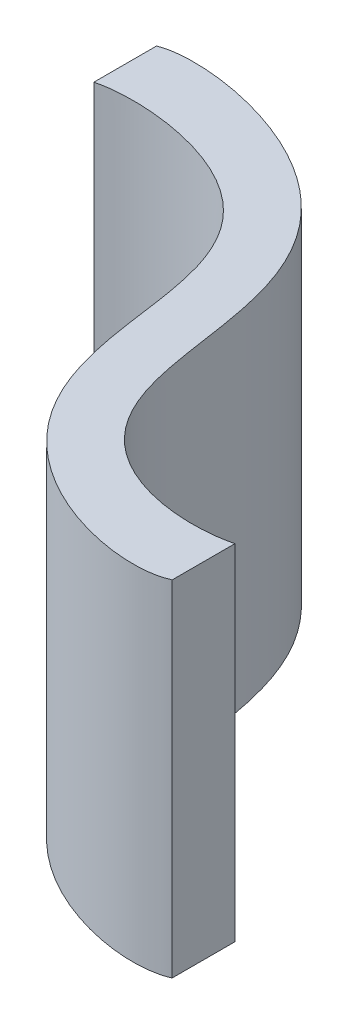
ISO-10303-21;
HEADER;
FILE_DESCRIPTION(('STEP AP214'),'2;1');
FILE_NAME('part.step','',(''),(''),'','','');
FILE_SCHEMA(('AUTOMOTIVE_DESIGN { 1 0 10303 214 1 1 1 1 }'));
ENDSEC;
DATA;
#1=APPLICATION_CONTEXT('core data for automotive mechanical design processes');
#2=APPLICATION_PROTOCOL_DEFINITION('international standard','automotive_design',2000,#1);
#3=PRODUCT_CONTEXT('',#1,'mechanical');
#4=PRODUCT('Part','Part','',(#3));
#5=PRODUCT_RELATED_PRODUCT_CATEGORY('part','',(#4));
#6=PRODUCT_DEFINITION_FORMATION('','',#4);
#7=PRODUCT_DEFINITION_CONTEXT('part definition',#1,'design');
#8=PRODUCT_DEFINITION('design','',#6,#7);
#9=PRODUCT_DEFINITION_SHAPE('','',#8);
#10=(LENGTH_UNIT() NAMED_UNIT(*) SI_UNIT(.MILLI.,.METRE.));
#11=(NAMED_UNIT(*) PLANE_ANGLE_UNIT() SI_UNIT($,.RADIAN.));
#12=(NAMED_UNIT(*) SI_UNIT($,.STERADIAN.) SOLID_ANGLE_UNIT());
#13=UNCERTAINTY_MEASURE_WITH_UNIT(LENGTH_MEASURE(1.E-05),#10,'distance_accuracy_value','');
#14=(GEOMETRIC_REPRESENTATION_CONTEXT(3) GLOBAL_UNCERTAINTY_ASSIGNED_CONTEXT((#13)) GLOBAL_UNIT_ASSIGNED_CONTEXT((#10,
#11,#12)) REPRESENTATION_CONTEXT('',''));
#15=CARTESIAN_POINT('',(0.,0.,0.));
#16=DIRECTION('',(0.,0.,1.));
#17=DIRECTION('',(1.,0.,0.));
#18=AXIS2_PLACEMENT_3D('',#15,#16,#17);
#19=CARTESIAN_POINT('',(-0.5913490824649,-0.73,0.5076247980768));
#20=CARTESIAN_POINT('',(-0.5941610685846,-0.73,0.5084882631158));
#21=CARTESIAN_POINT('',(-0.6133921513861,-0.73,0.5137602282053));
#22=CARTESIAN_POINT('',(-0.6542171284106,-0.73,0.5176543152791));
#23=CARTESIAN_POINT('',(-0.7102679712515,-0.73,0.5098478820539));
#24=CARTESIAN_POINT('',(-0.758394632902,-0.73,0.4898495439812));
#25=CARTESIAN_POINT('',(-0.7949168763485,-0.73,0.4590155199674));
#26=CARTESIAN_POINT('',(-0.8194299888275,-0.73,0.4190192594518));
#27=CARTESIAN_POINT('',(-0.838961768542,-0.73,0.3560689213173));
#28=CARTESIAN_POINT('',(-0.8464364409501,-0.73,0.2829334550989));
#29=CARTESIAN_POINT('',(-0.8620927468637,-0.73,0.2090170269646));
#30=CARTESIAN_POINT('',(-0.8827045525148,-0.73,0.1556569519024));
#31=CARTESIAN_POINT('',(-0.9156455990992,-0.73,0.1067991674162));
#32=CARTESIAN_POINT('',(-0.9624108400738,-0.73,0.06480975888406));
#33=CARTESIAN_POINT('',(-1.021749288482,-0.73,0.03193019406399));
#34=CARTESIAN_POINT('',(-1.088919793519,-0.73,0.01022494550388));
#35=CARTESIAN_POINT('',(-1.154934406862,-0.73,0.001525371232641));
#36=CARTESIAN_POINT('',(-1.192743090326,-0.73,0.005872413337106));
#37=CARTESIAN_POINT('',(-1.204805400898,-0.73,0.012235816933));
#38=CARTESIAN_POINT('',(-1.206709906201,-0.73,0.01356311523369));
#39=(BOUNDED_CURVE() B_SPLINE_CURVE(3,(#19,#20,#21,#22,#23,#24,#25,#26,#27,#28,#29,#30,#31,#32,
#33,#34,#35,#36,#37,#38),.UNSPECIFIED.,.F.,.F.) B_SPLINE_CURVE_WITH_KNOTS((4,1,1,1,1,1,1,1,1,1,
1,1,1,1,1,1,1,4),(0.,0.01076882705815,0.07172228724043,0.1326757474227,0.1936292076051,
0.2545826677874,0.3155361279698,0.3764895881521,0.4983965085167,0.559349968699,0.6203034288814,
0.6812568890637,0.742210349246,0.8031638094284,0.8641172696106,0.925070729793,0.986024189975,
1.),.UNSPECIFIED.) CURVE() GEOMETRIC_REPRESENTATION_ITEM() RATIONAL_B_SPLINE_CURVE((1.,1.,1.,1.,
1.,1.,1.,1.,1.,1.,1.,1.,1.,1.,1.,1.,1.,1.,1.,1.)) REPRESENTATION_ITEM(''));
#40=DIRECTION('',(0.,-1.,0.));
#41=VECTOR('',#40,1.);
#42=SURFACE_OF_LINEAR_EXTRUSION('',#39,#41);
#43=CARTESIAN_POINT('',(-0.6,-1.17,0.51));
#44=CARTESIAN_POINT('',(-0.616705772193,-1.17,0.5140762976533));
#45=CARTESIAN_POINT('',(-0.6542171284106,-1.17,0.5176543152791));
#46=CARTESIAN_POINT('',(-0.7102679712515,-1.17,0.5098478820539));
#47=CARTESIAN_POINT('',(-0.758394632902,-1.17,0.4898495439812));
#48=CARTESIAN_POINT('',(-0.7949168763485,-1.17,0.4590155199674));
#49=CARTESIAN_POINT('',(-0.8194299888275,-1.17,0.4190192594518));
#50=CARTESIAN_POINT('',(-0.838961768542,-1.17,0.3560689213173));
#51=CARTESIAN_POINT('',(-0.8464364409501,-1.17,0.2829334550989));
#52=CARTESIAN_POINT('',(-0.8620927468637,-1.17,0.2090170269646));
#53=CARTESIAN_POINT('',(-0.8827045525148,-1.17,0.1556569519024));
#54=CARTESIAN_POINT('',(-0.9156455990992,-1.17,0.1067991674162));
#55=CARTESIAN_POINT('',(-0.9624108400738,-1.17,0.06480975888406));
#56=CARTESIAN_POINT('',(-1.021749288482,-1.17,0.03193019406399));
#57=CARTESIAN_POINT('',(-1.088919793519,-1.17,0.01022494550388));
#58=CARTESIAN_POINT('',(-1.154934406862,-1.17,0.001525371232623));
#59=CARTESIAN_POINT('',(-1.18885439177,-1.17,0.005425311380565));
#60=CARTESIAN_POINT('',(-1.2,-1.17,0.009999999999981));
#61=B_SPLINE_CURVE_WITH_KNOTS('',3,(#43,#44,#45,#46,#47,#48,#49,#50,#51,#52,#53,#54,#55,#56,#57,
#58,#59,#60),.UNSPECIFIED.,.F.,.F.,(4,1,1,1,1,1,1,1,1,1,1,1,1,1,1,4),(0.,0.06249999999998,0.125,
0.1875,0.25,0.3125000000001,0.3750000000001,0.5000000000001,0.5625000000001,0.6250000000002,
0.6875000000002,0.7500000000002,0.8125000000003,0.8750000000002,0.9375000000002,1.),.UNSPECIFIED.);
#62=CARTESIAN_POINT('',(-0.6,-1.17,0.51));
#63=VERTEX_POINT('',#62);
#64=CARTESIAN_POINT('',(-1.2,-1.17,0.009999999999981));
#65=VERTEX_POINT('',#64);
#66=EDGE_CURVE('E11',#63,#65,#61,.T.);
#67=ORIENTED_EDGE('',*,*,#66,.T.);
#68=DIRECTION('',(0.,1.,0.));
#69=VECTOR('',#68,1.);
#70=CARTESIAN_POINT('',(-1.2,-1.17,0.009999999999981));
#71=LINE('',#70,#69);
#72=CARTESIAN_POINT('',(-1.2,-0.73,0.009999999999981));
#73=VERTEX_POINT('',#72);
#74=EDGE_CURVE('E50',#65,#73,#71,.T.);
#75=ORIENTED_EDGE('',*,*,#74,.T.);
#76=CARTESIAN_POINT('',(-1.2,-0.73,0.009999999999981));
#77=CARTESIAN_POINT('',(-1.18885439177,-0.73,0.005425311380565));
#78=CARTESIAN_POINT('',(-1.154934406862,-0.73,0.001525371232623));
#79=CARTESIAN_POINT('',(-1.088919793519,-0.73,0.01022494550388));
#80=CARTESIAN_POINT('',(-1.021749288482,-0.73,0.03193019406399));
#81=CARTESIAN_POINT('',(-0.9624108400738,-0.73,0.06480975888406));
#82=CARTESIAN_POINT('',(-0.9156455990992,-0.73,0.1067991674162));
#83=CARTESIAN_POINT('',(-0.8827045525148,-0.73,0.1556569519024));
#84=CARTESIAN_POINT('',(-0.8620927468637,-0.73,0.2090170269646));
#85=CARTESIAN_POINT('',(-0.8464364409501,-0.73,0.2829334550989));
#86=CARTESIAN_POINT('',(-0.838961768542,-0.73,0.3560689213173));
#87=CARTESIAN_POINT('',(-0.8194299888275,-0.73,0.4190192594518));
#88=CARTESIAN_POINT('',(-0.7949168763485,-0.73,0.4590155199674));
#89=CARTESIAN_POINT('',(-0.758394632902,-0.73,0.4898495439812));
#90=CARTESIAN_POINT('',(-0.7102679712515,-0.73,0.5098478820539));
#91=CARTESIAN_POINT('',(-0.6542171284106,-0.73,0.5176543152791));
#92=CARTESIAN_POINT('',(-0.616705772193,-0.73,0.5140762976533));
#93=CARTESIAN_POINT('',(-0.6,-0.73,0.51));
#94=B_SPLINE_CURVE_WITH_KNOTS('',3,(#76,#77,#78,#79,#80,#81,#82,#83,#84,#85,#86,#87,#88,#89,#90,
#91,#92,#93),.UNSPECIFIED.,.F.,.F.,(4,1,1,1,1,1,1,1,1,1,1,1,1,1,1,4),(0.,0.06249999999977,
0.1249999999998,0.1874999999997,0.2499999999998,0.3124999999998,0.3749999999998,0.4374999999999,
0.4999999999999,0.6249999999999,0.6874999999999,0.75,0.8125,0.875,0.9375,1.),.UNSPECIFIED.);
#95=CARTESIAN_POINT('',(-0.6,-0.73,0.51));
#96=VERTEX_POINT('',#95);
#97=EDGE_CURVE('E88',#73,#96,#94,.T.);
#98=ORIENTED_EDGE('',*,*,#97,.T.);
#99=DIRECTION('',(0.,-1.,0.));
#100=VECTOR('',#99,1.);
#101=CARTESIAN_POINT('',(-0.6,-0.73,0.51));
#102=LINE('',#101,#100);
#103=EDGE_CURVE('E81',#96,#63,#102,.T.);
#104=ORIENTED_EDGE('',*,*,#103,.T.);
#105=EDGE_LOOP('',(#67,#75,#98,#104));
#106=FACE_BOUND('',#105,.T.);
#107=ADVANCED_FACE('F17',(#106),#42,.F.);
#108=CARTESIAN_POINT('',(-0.6,-1.17,0.51));
#109=DIRECTION('',(0.,-1.,0.));
#110=DIRECTION('',(0.,0.,-1.));
#111=AXIS2_PLACEMENT_3D('',#108,#109,#110);
#112=PLANE('',#111);
#113=CARTESIAN_POINT('',(-1.2,-1.17,0.09000000000003));
#114=CARTESIAN_POINT('',(-1.18623867026,-1.17,0.08637735712104));
#115=CARTESIAN_POINT('',(-1.150421140735,-1.17,0.08316806811083));
#116=CARTESIAN_POINT('',(-1.089230576239,-1.17,0.09011182736279));
#117=CARTESIAN_POINT('',(-1.032147642144,-1.17,0.1081455077825));
#118=CARTESIAN_POINT('',(-0.985779085495,-1.17,0.1363043716705));
#119=CARTESIAN_POINT('',(-0.9526075074956,-1.17,0.1733462416459));
#120=CARTESIAN_POINT('',(-0.9318436995672,-1.17,0.217771290084));
#121=CARTESIAN_POINT('',(-0.9202759440667,-1.17,0.2678417580811));
#122=CARTESIAN_POINT('',(-0.913120128043,-1.17,0.3216016932944));
#123=CARTESIAN_POINT('',(-0.9048696401815,-1.17,0.3768966827501));
#124=CARTESIAN_POINT('',(-0.8901453219529,-1.17,0.4313935869083));
#125=CARTESIAN_POINT('',(-0.8645454187609,-1.17,0.4826002737286));
#126=CARTESIAN_POINT('',(-0.8254954768878,-1.17,0.5278853514777));
#127=CARTESIAN_POINT('',(-0.7730984572501,-1.17,0.5644979065696));
#128=CARTESIAN_POINT('',(-0.7109840361159,-1.17,0.5895872225304));
#129=CARTESIAN_POINT('',(-0.6471609411671,-1.17,0.6002225694358));
#130=CARTESIAN_POINT('',(-0.6122922865337,-1.17,0.5956826766982));
#131=CARTESIAN_POINT('',(-0.6,-1.17,0.59));
#132=B_SPLINE_CURVE_WITH_KNOTS('',3,(#113,#114,#115,#116,#117,#118,#119,#120,#121,#122,#123,
#124,#125,#126,#127,#128,#129,#130,#131),.UNSPECIFIED.,.F.,.F.,(4,1,1,1,1,1,1,1,1,1,1,1,1,1,1,1,
4),(0.,0.06250000000052,0.1250000000005,0.1875000000004,0.2500000000004,0.3125000000003,
0.3750000000004,0.4375000000004,0.5000000000003,0.5625000000003,0.6250000000002,0.6875000000002,
0.7500000000001,0.8125000000001,0.8750000000001,0.9375,1.),.UNSPECIFIED.);
#133=CARTESIAN_POINT('',(-1.2,-1.17,0.09000000000003));
#134=VERTEX_POINT('',#133);
#135=CARTESIAN_POINT('',(-0.6,-1.17,0.59));
#136=VERTEX_POINT('',#135);
#137=EDGE_CURVE('E91',#134,#136,#132,.T.);
#138=ORIENTED_EDGE('',*,*,#137,.F.);
#139=DIRECTION('',(-2.053912595555E-13,0.,-1.));
#140=VECTOR('',#139,1.);
#141=CARTESIAN_POINT('',(-1.2,-1.17,0.09000000000003));
#142=LINE('',#141,#140);
#143=EDGE_CURVE('E26',#134,#65,#142,.T.);
#144=ORIENTED_EDGE('',*,*,#143,.T.);
#145=ORIENTED_EDGE('',*,*,#66,.F.);
#146=DIRECTION('',(0.,0.,1.));
#147=VECTOR('',#146,1.);
#148=CARTESIAN_POINT('',(-0.6,-1.17,0.51));
#149=LINE('',#148,#147);
#150=EDGE_CURVE('E94',#63,#136,#149,.T.);
#151=ORIENTED_EDGE('',*,*,#150,.T.);
#152=EDGE_LOOP('',(#138,#144,#145,#151));
#153=FACE_BOUND('',#152,.T.);
#154=ADVANCED_FACE('F143',(#153),#112,.T.);
#155=CARTESIAN_POINT('',(-1.2,-1.17,0.09));
#156=DIRECTION('',(-1.,0.,0.));
#157=DIRECTION('',(0.,0.,1.));
#158=AXIS2_PLACEMENT_3D('',#155,#156,#157);
#159=PLANE('',#158);
#160=DIRECTION('',(2.053912595555E-13,0.,1.));
#161=VECTOR('',#160,1.);
#162=CARTESIAN_POINT('',(-1.2,-0.73,0.009999999999981));
#163=LINE('',#162,#161);
#164=CARTESIAN_POINT('',(-1.2,-0.73,0.09000000000003));
#165=VERTEX_POINT('',#164);
#166=EDGE_CURVE('E96',#73,#165,#163,.T.);
#167=ORIENTED_EDGE('',*,*,#166,.F.);
#168=ORIENTED_EDGE('',*,*,#74,.F.);
#169=ORIENTED_EDGE('',*,*,#143,.F.);
#170=DIRECTION('',(0.,-1.,0.));
#171=VECTOR('',#170,1.);
#172=CARTESIAN_POINT('',(-1.2,-0.73,0.09000000000003));
#173=LINE('',#172,#171);
#174=EDGE_CURVE('E101',#165,#134,#173,.T.);
#175=ORIENTED_EDGE('',*,*,#174,.F.);
#176=EDGE_LOOP('',(#167,#168,#169,#175));
#177=FACE_BOUND('',#176,.T.);
#178=ADVANCED_FACE('F148',(#177),#159,.T.);
#179=CARTESIAN_POINT('',(-0.6,-0.73,0.59));
#180=DIRECTION('',(0.,1.,0.));
#181=DIRECTION('',(1.,0.,0.));
#182=AXIS2_PLACEMENT_3D('',#179,#180,#181);
#183=PLANE('',#182);
#184=ORIENTED_EDGE('',*,*,#97,.F.);
#185=ORIENTED_EDGE('',*,*,#166,.T.);
#186=CARTESIAN_POINT('',(-0.6,-0.73,0.59));
#187=CARTESIAN_POINT('',(-0.6122922865337,-0.73,0.5956826766982));
#188=CARTESIAN_POINT('',(-0.6471609411671,-0.73,0.6002225694358));
#189=CARTESIAN_POINT('',(-0.7109840361159,-0.73,0.5895872225304));
#190=CARTESIAN_POINT('',(-0.7730984572501,-0.73,0.5644979065696));
#191=CARTESIAN_POINT('',(-0.8254954768878,-0.73,0.5278853514777));
#192=CARTESIAN_POINT('',(-0.8645454187609,-0.73,0.4826002737286));
#193=CARTESIAN_POINT('',(-0.8901453219529,-0.73,0.4313935869083));
#194=CARTESIAN_POINT('',(-0.9048696401815,-0.73,0.3768966827501));
#195=CARTESIAN_POINT('',(-0.913120128043,-0.73,0.3216016932944));
#196=CARTESIAN_POINT('',(-0.9202759440667,-0.73,0.2678417580811));
#197=CARTESIAN_POINT('',(-0.9318436995672,-0.73,0.217771290084));
#198=CARTESIAN_POINT('',(-0.9526075074956,-0.73,0.1733462416459));
#199=CARTESIAN_POINT('',(-0.985779085495,-0.73,0.1363043716705));
#200=CARTESIAN_POINT('',(-1.032147642144,-0.73,0.1081455077825));
#201=CARTESIAN_POINT('',(-1.089230576239,-0.73,0.09011182736279));
#202=CARTESIAN_POINT('',(-1.150421140735,-0.73,0.08316806811083));
#203=CARTESIAN_POINT('',(-1.18623867026,-0.73,0.08637735712104));
#204=CARTESIAN_POINT('',(-1.2,-0.73,0.09000000000003));
#205=B_SPLINE_CURVE_WITH_KNOTS('',3,(#186,#187,#188,#189,#190,#191,#192,#193,#194,#195,#196,
#197,#198,#199,#200,#201,#202,#203,#204),.UNSPECIFIED.,.F.,.F.,(4,1,1,1,1,1,1,1,1,1,1,1,1,1,1,1,
4),(0.,0.06249999999997,0.1249999999999,0.1874999999999,0.2499999999999,0.3124999999998,
0.3749999999998,0.4374999999997,0.4999999999997,0.5624999999996,0.6249999999996,0.6874999999997,
0.7499999999996,0.8124999999996,0.8749999999995,0.9374999999995,1.),.UNSPECIFIED.);
#206=CARTESIAN_POINT('',(-0.6,-0.73,0.59));
#207=VERTEX_POINT('',#206);
#208=EDGE_CURVE('E21',#207,#165,#205,.T.);
#209=ORIENTED_EDGE('',*,*,#208,.F.);
#210=DIRECTION('',(0.,0.,-1.));
#211=VECTOR('',#210,1.);
#212=CARTESIAN_POINT('',(-0.6,-0.73,0.59));
#213=LINE('',#212,#211);
#214=EDGE_CURVE('E74',#207,#96,#213,.T.);
#215=ORIENTED_EDGE('',*,*,#214,.T.);
#216=EDGE_LOOP('',(#184,#185,#209,#215));
#217=FACE_BOUND('',#216,.T.);
#218=ADVANCED_FACE('F100',(#217),#183,.T.);
#219=CARTESIAN_POINT('',(-0.6,-1.17,0.59));
#220=DIRECTION('',(-1.,0.,0.));
#221=DIRECTION('',(0.,0.,1.));
#222=AXIS2_PLACEMENT_3D('',#219,#220,#221);
#223=PLANE('',#222);
#224=ORIENTED_EDGE('',*,*,#150,.F.);
#225=ORIENTED_EDGE('',*,*,#103,.F.);
#226=ORIENTED_EDGE('',*,*,#214,.F.);
#227=DIRECTION('',(0.,1.,0.));
#228=VECTOR('',#227,1.);
#229=CARTESIAN_POINT('',(-0.6,-1.17,0.59));
#230=LINE('',#229,#228);
#231=EDGE_CURVE('E76',#136,#207,#230,.T.);
#232=ORIENTED_EDGE('',*,*,#231,.F.);
#233=EDGE_LOOP('',(#224,#225,#226,#232));
#234=FACE_BOUND('',#233,.T.);
#235=ADVANCED_FACE('F79',(#234),#223,.F.);
#236=CARTESIAN_POINT('',(-0.5922494008439,-1.17,0.5854381369794));
#237=CARTESIAN_POINT('',(-0.5945231552874,-1.17,0.58715035925));
#238=CARTESIAN_POINT('',(-0.6082082419009,-1.17,0.5951509348009));
#239=CARTESIAN_POINT('',(-0.6471609411671,-1.17,0.6002225694358));
#240=CARTESIAN_POINT('',(-0.7109840361159,-1.17,0.5895872225304));
#241=CARTESIAN_POINT('',(-0.7730984572501,-1.17,0.5644979065696));
#242=CARTESIAN_POINT('',(-0.8254954768878,-1.17,0.5278853514777));
#243=CARTESIAN_POINT('',(-0.8645454187609,-1.17,0.4826002737286));
#244=CARTESIAN_POINT('',(-0.8901453219529,-1.17,0.4313935869083));
#245=CARTESIAN_POINT('',(-0.9048696401815,-1.17,0.3768966827501));
#246=CARTESIAN_POINT('',(-0.913120128043,-1.17,0.3216016932944));
#247=CARTESIAN_POINT('',(-0.9202759440667,-1.17,0.2678417580811));
#248=CARTESIAN_POINT('',(-0.9318436995672,-1.17,0.217771290084));
#249=CARTESIAN_POINT('',(-0.9526075074956,-1.17,0.1733462416459));
#250=CARTESIAN_POINT('',(-0.985779085495,-1.17,0.1363043716705));
#251=CARTESIAN_POINT('',(-1.032147642144,-1.17,0.1081455077825));
#252=CARTESIAN_POINT('',(-1.089230576239,-1.17,0.0901118273628));
#253=CARTESIAN_POINT('',(-1.150421140735,-1.17,0.0831680681108));
#254=CARTESIAN_POINT('',(-1.189830579018,-1.17,0.08669919599326));
#255=CARTESIAN_POINT('',(-1.20535330009,-1.17,0.09153434418562));
#256=CARTESIAN_POINT('',(-1.207756265606,-1.17,0.09242375482874));
#257=(BOUNDED_CURVE() B_SPLINE_CURVE(3,(#236,#237,#238,#239,#240,#241,#242,#243,#244,#245,#246,
#247,#248,#249,#250,#251,#252,#253,#254,#255,#256),.UNSPECIFIED.,.F.,
.F.) B_SPLINE_CURVE_WITH_KNOTS((4,1,1,1,1,1,1,1,1,1,1,1,1,1,1,1,1,1,4),(0.,0.01425346089181,
0.07509988274153,0.1359463045912,0.196792726441,0.2576391482907,0.3184855701404,0.3793319919901,
0.4401784138398,0.5010248356895,0.5618712575392,0.6227176793889,0.6835641012387,0.7444105230883,
0.8052569449381,0.8661033667877,0.9269497886375,0.9877962104878,1.),
.UNSPECIFIED.) CURVE() GEOMETRIC_REPRESENTATION_ITEM() RATIONAL_B_SPLINE_CURVE((1.,1.,1.,1.,1.,
1.,1.,1.,1.,1.,1.,1.,1.,1.,1.,1.,1.,1.,1.,1.,1.)) REPRESENTATION_ITEM(''));
#258=DIRECTION('',(0.,1.,0.));
#259=VECTOR('',#258,1.);
#260=SURFACE_OF_LINEAR_EXTRUSION('',#257,#259);
#261=ORIENTED_EDGE('',*,*,#208,.T.);
#262=ORIENTED_EDGE('',*,*,#174,.T.);
#263=ORIENTED_EDGE('',*,*,#137,.T.);
#264=ORIENTED_EDGE('',*,*,#231,.T.);
#265=EDGE_LOOP('',(#261,#262,#263,#264));
#266=FACE_BOUND('',#265,.T.);
#267=ADVANCED_FACE('F86',(#266),#260,.F.);
#268=CLOSED_SHELL('',(#107,#154,#178,#218,#235,#267));
#269=MANIFOLD_SOLID_BREP('B1',#268);
#270=ADVANCED_BREP_SHAPE_REPRESENTATION('',(#18,#269),#14);
#271=SHAPE_DEFINITION_REPRESENTATION(#9,#270);
ENDSEC;
END-ISO-10303-21;
